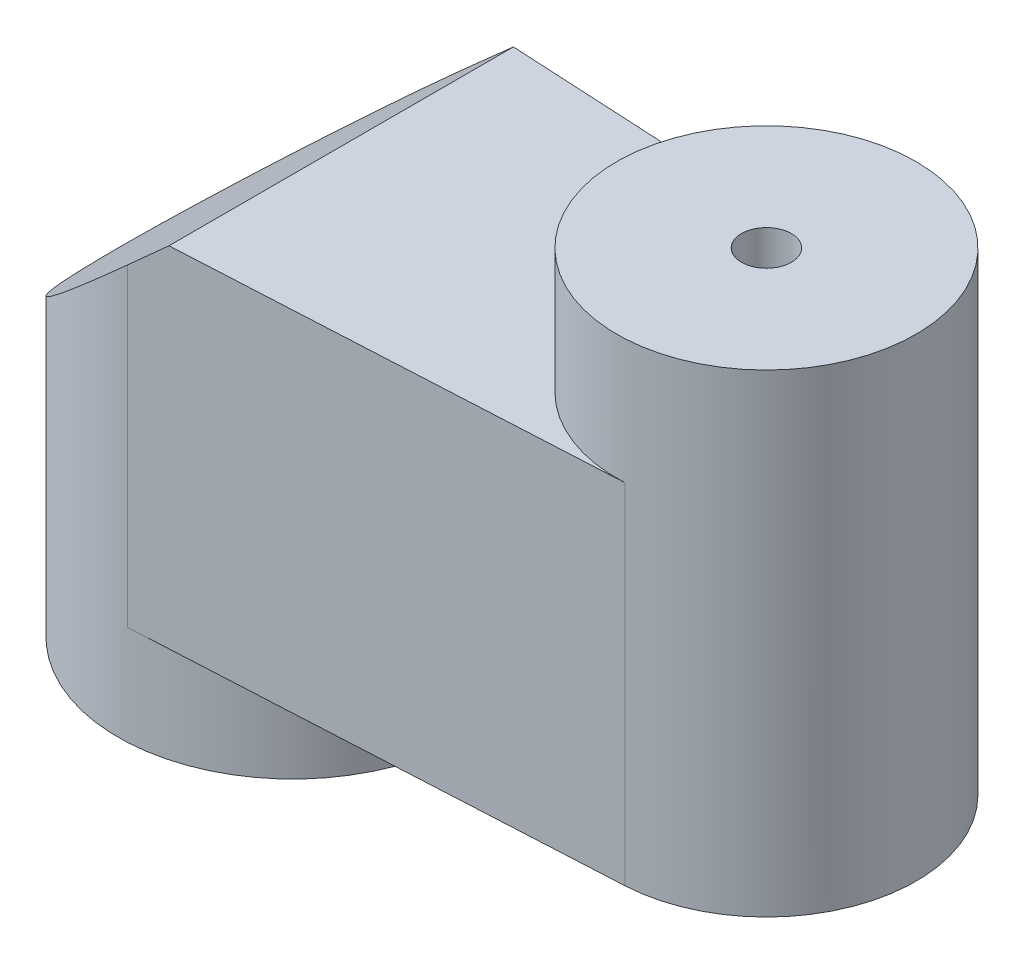
ISO-10303-21;
HEADER;
FILE_DESCRIPTION(('STEP AP214'),'2;1');
FILE_NAME('part.step','',(''),(''),'','','');
FILE_SCHEMA(('AUTOMOTIVE_DESIGN { 1 0 10303 214 1 1 1 1 }'));
ENDSEC;
DATA;
#1=APPLICATION_CONTEXT('core data for automotive mechanical design processes');
#2=APPLICATION_PROTOCOL_DEFINITION('international standard','automotive_design',2000,#1);
#3=PRODUCT_CONTEXT('',#1,'mechanical');
#4=PRODUCT('Part','Part','',(#3));
#5=PRODUCT_RELATED_PRODUCT_CATEGORY('part','',(#4));
#6=PRODUCT_DEFINITION_FORMATION('','',#4);
#7=PRODUCT_DEFINITION_CONTEXT('part definition',#1,'design');
#8=PRODUCT_DEFINITION('design','',#6,#7);
#9=PRODUCT_DEFINITION_SHAPE('','',#8);
#10=(LENGTH_UNIT() NAMED_UNIT(*) SI_UNIT(.MILLI.,.METRE.));
#11=(NAMED_UNIT(*) PLANE_ANGLE_UNIT() SI_UNIT($,.RADIAN.));
#12=(NAMED_UNIT(*) SI_UNIT($,.STERADIAN.) SOLID_ANGLE_UNIT());
#13=UNCERTAINTY_MEASURE_WITH_UNIT(LENGTH_MEASURE(1.E-05),#10,'distance_accuracy_value','');
#14=(GEOMETRIC_REPRESENTATION_CONTEXT(3) GLOBAL_UNCERTAINTY_ASSIGNED_CONTEXT((#13)) GLOBAL_UNIT_ASSIGNED_CONTEXT((#10,
#11,#12)) REPRESENTATION_CONTEXT('',''));
#15=CARTESIAN_POINT('',(0.,0.,0.));
#16=DIRECTION('',(0.,0.,1.));
#17=DIRECTION('',(1.,0.,0.));
#18=AXIS2_PLACEMENT_3D('',#15,#16,#17);
#19=CARTESIAN_POINT('',(0.,20.,0.));
#20=DIRECTION('',(0.,-1.,0.));
#21=DIRECTION('',(0.,0.,1.));
#22=AXIS2_PLACEMENT_3D('',#19,#20,#21);
#23=CYLINDRICAL_SURFACE('',#22,35.);
#24=CARTESIAN_POINT('',(0.,81.3049516849971,0.));
#25=DIRECTION('',(-0.666666666666667,0.74535599249993,0.));
#26=DIRECTION('',(-0.74535599249993,-0.666666666666667,0.));
#27=AXIS2_PLACEMENT_3D('',#24,#25,#26);
#28=ELLIPSE('',#27,46.9574275274956,35.);
#29=CARTESIAN_POINT('',(1.8421052631579,82.9525807210496,-34.9514899281768));
#30=VERTEX_POINT('',#29);
#31=CARTESIAN_POINT('',(1.8421052631579,82.9525807210496,34.9514899281768));
#32=VERTEX_POINT('',#31);
#33=EDGE_CURVE('E98',#30,#32,#28,.T.);
#34=ORIENTED_EDGE('',*,*,#33,.F.);
#35=DIRECTION('',(0.,-1.,0.));
#36=VECTOR('',#35,1.);
#37=CARTESIAN_POINT('',(1.8421052631579,90.,-34.9514899281768));
#38=LINE('',#37,#36);
#39=CARTESIAN_POINT('',(1.8421052631579,20.,-34.9514899281768));
#40=VERTEX_POINT('',#39);
#41=EDGE_CURVE('E122',#30,#40,#38,.T.);
#42=ORIENTED_EDGE('',*,*,#41,.T.);
#43=CARTESIAN_POINT('',(0.,20.,0.));
#44=DIRECTION('',(0.,-1.,0.));
#45=DIRECTION('',(0.,0.,-1.));
#46=AXIS2_PLACEMENT_3D('',#43,#44,#45);
#47=CIRCLE('',#46,35.);
#48=CARTESIAN_POINT('',(1.8421052631579,20.,34.9514899281768));
#49=VERTEX_POINT('',#48);
#50=EDGE_CURVE('E126',#40,#49,#47,.T.);
#51=ORIENTED_EDGE('',*,*,#50,.T.);
#52=DIRECTION('',(0.,-1.,0.));
#53=VECTOR('',#52,1.);
#54=CARTESIAN_POINT('',(1.8421052631579,90.,34.9514899281768));
#55=LINE('',#54,#53);
#56=EDGE_CURVE('E106',#32,#49,#55,.T.);
#57=ORIENTED_EDGE('',*,*,#56,.F.);
#58=EDGE_LOOP('',(#34,#42,#51,#57));
#59=FACE_BOUND('',#58,.T.);
#60=CARTESIAN_POINT('',(0.,0.,0.));
#61=DIRECTION('',(0.,-1.,0.));
#62=DIRECTION('',(0.,0.,-1.));
#63=AXIS2_PLACEMENT_3D('',#60,#61,#62);
#64=CIRCLE('',#63,35.);
#65=CARTESIAN_POINT('',(0.,0.,-35.));
#66=VERTEX_POINT('',#65);
#67=EDGE_CURVE('E125',#66,#66,#64,.T.);
#68=ORIENTED_EDGE('',*,*,#67,.F.);
#69=EDGE_LOOP('',(#68));
#70=FACE_BOUND('',#69,.T.);
#71=ADVANCED_FACE('F43',(#59,#70),#23,.T.);
#72=CARTESIAN_POINT('',(0.,0.,0.));
#73=DIRECTION('',(0.,1.,0.));
#74=DIRECTION('',(0.,0.,-1.));
#75=AXIS2_PLACEMENT_3D('',#72,#73,#74);
#76=PLANE('',#75);
#77=ORIENTED_EDGE('',*,*,#67,.T.);
#78=EDGE_LOOP('',(#77));
#79=FACE_BOUND('',#78,.T.);
#80=ADVANCED_FACE('F131',(#79),#76,.F.);
#81=CARTESIAN_POINT('',(0.,20.,0.));
#82=DIRECTION('',(0.,1.,0.));
#83=DIRECTION('',(0.,0.,-1.));
#84=AXIS2_PLACEMENT_3D('',#81,#82,#83);
#85=PLANE('',#84);
#86=CARTESIAN_POINT('',(95.,20.,0.));
#87=DIRECTION('',(0.,-1.,0.));
#88=DIRECTION('',(0.,0.,-1.));
#89=AXIS2_PLACEMENT_3D('',#86,#87,#88);
#90=CIRCLE('',#89,5.);
#91=CARTESIAN_POINT('',(95.,20.,-5.));
#92=VERTEX_POINT('',#91);
#93=EDGE_CURVE('E101',#92,#92,#90,.T.);
#94=ORIENTED_EDGE('',*,*,#93,.F.);
#95=EDGE_LOOP('',(#94));
#96=FACE_BOUND('',#95,.T.);
#97=DIRECTION('',(0.998613997947909,0.,0.0526315789473686));
#98=VECTOR('',#97,1.);
#99=CARTESIAN_POINT('',(1.8421052631579,20.,-34.9514899281768));
#100=LINE('',#99,#98);
#101=CARTESIAN_POINT('',(96.5789473684211,20.,-29.9584199384373));
#102=VERTEX_POINT('',#101);
#103=EDGE_CURVE('E112',#40,#102,#100,.T.);
#104=ORIENTED_EDGE('',*,*,#103,.T.);
#105=CARTESIAN_POINT('',(95.,20.,0.));
#106=DIRECTION('',(0.,-1.,0.));
#107=DIRECTION('',(0.,0.,-1.));
#108=AXIS2_PLACEMENT_3D('',#105,#106,#107);
#109=CIRCLE('',#108,30.);
#110=CARTESIAN_POINT('',(96.5789473684211,20.,29.9584199384373));
#111=VERTEX_POINT('',#110);
#112=EDGE_CURVE('E115',#102,#111,#109,.T.);
#113=ORIENTED_EDGE('',*,*,#112,.T.);
#114=DIRECTION('',(-0.998613997947909,0.,0.0526315789473685));
#115=VECTOR('',#114,1.);
#116=CARTESIAN_POINT('',(1.8421052631579,20.,34.9514899281768));
#117=LINE('',#116,#115);
#118=EDGE_CURVE('E63',#111,#49,#117,.T.);
#119=ORIENTED_EDGE('',*,*,#118,.T.);
#120=ORIENTED_EDGE('',*,*,#50,.F.);
#121=EDGE_LOOP('',(#104,#113,#119,#120));
#122=FACE_BOUND('',#121,.T.);
#123=ADVANCED_FACE('F138',(#96,#122),#85,.F.);
#124=CARTESIAN_POINT('',(1.8421052631579,90.,-34.9514899281768));
#125=DIRECTION('',(-0.0526315789473686,0.,0.998613997947909));
#126=DIRECTION('',(-0.998613997947909,0.,-0.0526315789473686));
#127=AXIS2_PLACEMENT_3D('',#124,#125,#126);
#128=PLANE('',#127);
#129=DIRECTION('',(0.998613997947909,0.,0.0526315789473686));
#130=VECTOR('',#129,1.);
#131=CARTESIAN_POINT('',(1.8421052631579,90.,-34.9514899281768));
#132=LINE('',#131,#130);
#133=CARTESIAN_POINT('',(9.72135954999578,90.,-34.536216764676));
#134=VERTEX_POINT('',#133);
#135=CARTESIAN_POINT('',(96.5789473684211,90.,-29.9584199384373));
#136=VERTEX_POINT('',#135);
#137=EDGE_CURVE('E93',#134,#136,#132,.T.);
#138=ORIENTED_EDGE('',*,*,#137,.T.);
#139=DIRECTION('',(0.,-1.,0.));
#140=VECTOR('',#139,1.);
#141=CARTESIAN_POINT('',(96.5789473684211,90.,-29.9584199384373));
#142=LINE('',#141,#140);
#143=EDGE_CURVE('E120',#136,#102,#142,.T.);
#144=ORIENTED_EDGE('',*,*,#143,.T.);
#145=ORIENTED_EDGE('',*,*,#103,.F.);
#146=ORIENTED_EDGE('',*,*,#41,.F.);
#147=DIRECTION('',(-0.744781536929041,-0.666152857984043,-0.0392534335989431));
#148=VECTOR('',#147,1.);
#149=CARTESIAN_POINT('',(5.33860023173927,86.0799408941431,-34.7672084627096));
#150=LINE('',#149,#148);
#151=EDGE_CURVE('E140',#134,#30,#150,.T.);
#152=ORIENTED_EDGE('',*,*,#151,.F.);
#153=EDGE_LOOP('',(#138,#144,#145,#146,#152));
#154=FACE_BOUND('',#153,.T.);
#155=ADVANCED_FACE('F152',(#154),#128,.F.);
#156=CARTESIAN_POINT('',(95.,90.,0.));
#157=DIRECTION('',(0.,-1.,0.));
#158=DIRECTION('',(0.,0.,1.));
#159=AXIS2_PLACEMENT_3D('',#156,#157,#158);
#160=CYLINDRICAL_SURFACE('',#159,30.);
#161=ORIENTED_EDGE('',*,*,#112,.F.);
#162=ORIENTED_EDGE('',*,*,#143,.F.);
#163=CARTESIAN_POINT('',(95.,90.,0.));
#164=DIRECTION('',(0.,-1.,0.));
#165=DIRECTION('',(0.,0.,-1.));
#166=AXIS2_PLACEMENT_3D('',#163,#164,#165);
#167=CIRCLE('',#166,30.);
#168=CARTESIAN_POINT('',(96.5789473684211,90.,29.9584199384373));
#169=VERTEX_POINT('',#168);
#170=EDGE_CURVE('E50',#169,#136,#167,.T.);
#171=ORIENTED_EDGE('',*,*,#170,.F.);
#172=DIRECTION('',(0.,-1.,0.));
#173=VECTOR('',#172,1.);
#174=CARTESIAN_POINT('',(96.5789473684211,90.,29.9584199384373));
#175=LINE('',#174,#173);
#176=EDGE_CURVE('E104',#169,#111,#175,.T.);
#177=ORIENTED_EDGE('',*,*,#176,.T.);
#178=EDGE_LOOP('',(#161,#162,#171,#177));
#179=FACE_BOUND('',#178,.T.);
#180=CARTESIAN_POINT('',(95.,115.,0.));
#181=DIRECTION('',(0.,-1.,0.));
#182=DIRECTION('',(0.,0.,-1.));
#183=AXIS2_PLACEMENT_3D('',#180,#181,#182);
#184=CIRCLE('',#183,30.);
#185=CARTESIAN_POINT('',(95.,115.,-30.));
#186=VERTEX_POINT('',#185);
#187=EDGE_CURVE('E116',#186,#186,#184,.T.);
#188=ORIENTED_EDGE('',*,*,#187,.T.);
#189=EDGE_LOOP('',(#188));
#190=FACE_BOUND('',#189,.T.);
#191=ADVANCED_FACE('F149',(#179,#190),#160,.T.);
#192=CARTESIAN_POINT('',(1.8421052631579,90.,34.9514899281768));
#193=DIRECTION('',(-0.0526315789473685,0.,-0.998613997947909));
#194=DIRECTION('',(0.998613997947909,0.,-0.0526315789473685));
#195=AXIS2_PLACEMENT_3D('',#192,#193,#194);
#196=PLANE('',#195);
#197=ORIENTED_EDGE('',*,*,#56,.T.);
#198=ORIENTED_EDGE('',*,*,#118,.F.);
#199=ORIENTED_EDGE('',*,*,#176,.F.);
#200=DIRECTION('',(-0.998613997947909,0.,0.0526315789473685));
#201=VECTOR('',#200,1.);
#202=CARTESIAN_POINT('',(1.8421052631579,90.,34.9514899281768));
#203=LINE('',#202,#201);
#204=CARTESIAN_POINT('',(9.72135954999578,90.,34.5362167646759));
#205=VERTEX_POINT('',#204);
#206=EDGE_CURVE('E90',#169,#205,#203,.T.);
#207=ORIENTED_EDGE('',*,*,#206,.T.);
#208=DIRECTION('',(0.744781536929041,0.666152857984043,-0.039253433598943));
#209=VECTOR('',#208,1.);
#210=CARTESIAN_POINT('',(5.33860023173927,86.0799408941431,34.7672084627096));
#211=LINE('',#210,#209);
#212=EDGE_CURVE('E95',#32,#205,#211,.T.);
#213=ORIENTED_EDGE('',*,*,#212,.F.);
#214=EDGE_LOOP('',(#197,#198,#199,#207,#213));
#215=FACE_BOUND('',#214,.T.);
#216=ADVANCED_FACE('F103',(#215),#196,.F.);
#217=CARTESIAN_POINT('',(0.,90.,0.));
#218=DIRECTION('',(0.,1.,0.));
#219=DIRECTION('',(0.,0.,-1.));
#220=AXIS2_PLACEMENT_3D('',#217,#218,#219);
#221=PLANE('',#220);
#222=DIRECTION('',(0.,0.,1.));
#223=VECTOR('',#222,1.);
#224=CARTESIAN_POINT('',(9.72135954999578,90.,0.));
#225=LINE('',#224,#223);
#226=EDGE_CURVE('E11',#134,#205,#225,.T.);
#227=ORIENTED_EDGE('',*,*,#226,.T.);
#228=ORIENTED_EDGE('',*,*,#206,.F.);
#229=ORIENTED_EDGE('',*,*,#170,.T.);
#230=ORIENTED_EDGE('',*,*,#137,.F.);
#231=EDGE_LOOP('',(#227,#228,#229,#230));
#232=FACE_BOUND('',#231,.T.);
#233=ADVANCED_FACE('F88',(#232),#221,.T.);
#234=CARTESIAN_POINT('',(95.,115.,0.));
#235=DIRECTION('',(0.,1.,0.));
#236=DIRECTION('',(0.,0.,-1.));
#237=AXIS2_PLACEMENT_3D('',#234,#235,#236);
#238=PLANE('',#237);
#239=CARTESIAN_POINT('',(95.,115.,0.));
#240=DIRECTION('',(0.,-1.,0.));
#241=DIRECTION('',(0.,0.,-1.));
#242=AXIS2_PLACEMENT_3D('',#239,#240,#241);
#243=CIRCLE('',#242,5.);
#244=CARTESIAN_POINT('',(95.,115.,-5.));
#245=VERTEX_POINT('',#244);
#246=EDGE_CURVE('E242',#245,#245,#243,.T.);
#247=ORIENTED_EDGE('',*,*,#246,.T.);
#248=EDGE_LOOP('',(#247));
#249=FACE_BOUND('',#248,.T.);
#250=ORIENTED_EDGE('',*,*,#187,.F.);
#251=EDGE_LOOP('',(#250));
#252=FACE_BOUND('',#251,.T.);
#253=ADVANCED_FACE('F183',(#249,#252),#238,.T.);
#254=CARTESIAN_POINT('',(9.72135954999578,90.,44.));
#255=DIRECTION('',(0.666666666666667,-0.74535599249993,0.));
#256=DIRECTION('',(0.74535599249993,0.666666666666667,0.));
#257=AXIS2_PLACEMENT_3D('',#254,#255,#256);
#258=PLANE('',#257);
#259=ORIENTED_EDGE('',*,*,#226,.F.);
#260=ORIENTED_EDGE('',*,*,#151,.T.);
#261=ORIENTED_EDGE('',*,*,#33,.T.);
#262=ORIENTED_EDGE('',*,*,#212,.T.);
#263=EDGE_LOOP('',(#259,#260,#261,#262));
#264=FACE_BOUND('',#263,.T.);
#265=ADVANCED_FACE('F96',(#264),#258,.F.);
#266=CARTESIAN_POINT('',(95.,0.,0.));
#267=DIRECTION('',(0.,1.,0.));
#268=DIRECTION('',(0.,0.,-1.));
#269=AXIS2_PLACEMENT_3D('',#266,#267,#268);
#270=CYLINDRICAL_SURFACE('',#269,5.);
#271=CARTESIAN_POINT('',(95.,115.,-5.));
#272=CARTESIAN_POINT('',(95.,114.010416666667,-5.));
#273=CARTESIAN_POINT('',(95.,113.020833333333,-5.));
#274=CARTESIAN_POINT('',(95.,111.041666666667,-5.));
#275=CARTESIAN_POINT('',(95.,110.052083333333,-5.));
#276=CARTESIAN_POINT('',(95.,108.072916666667,-5.));
#277=CARTESIAN_POINT('',(95.,107.083333333333,-5.));
#278=CARTESIAN_POINT('',(95.,105.104166666667,-5.));
#279=CARTESIAN_POINT('',(95.,104.114583333333,-5.));
#280=CARTESIAN_POINT('',(95.,102.135416666667,-5.));
#281=CARTESIAN_POINT('',(95.,101.145833333333,-5.));
#282=CARTESIAN_POINT('',(95.,99.1666666666667,-5.));
#283=CARTESIAN_POINT('',(95.,98.1770833333334,-5.));
#284=CARTESIAN_POINT('',(95.,96.1979166666667,-5.));
#285=CARTESIAN_POINT('',(95.,95.2083333333334,-5.));
#286=CARTESIAN_POINT('',(95.,93.2291666666667,-5.));
#287=CARTESIAN_POINT('',(95.,92.2395833333334,-5.));
#288=CARTESIAN_POINT('',(95.,90.2604166666667,-5.));
#289=CARTESIAN_POINT('',(95.,89.2708333333334,-5.));
#290=CARTESIAN_POINT('',(95.,87.2916666666667,-5.));
#291=CARTESIAN_POINT('',(95.,86.3020833333334,-5.));
#292=CARTESIAN_POINT('',(95.,84.3229166666667,-5.));
#293=CARTESIAN_POINT('',(95.,83.3333333333334,-5.));
#294=CARTESIAN_POINT('',(95.,81.3541666666667,-5.));
#295=CARTESIAN_POINT('',(95.,80.3645833333334,-5.));
#296=CARTESIAN_POINT('',(95.,78.3854166666667,-5.));
#297=CARTESIAN_POINT('',(95.,77.3958333333334,-5.));
#298=CARTESIAN_POINT('',(95.,75.4166666666667,-5.));
#299=CARTESIAN_POINT('',(95.,74.4270833333334,-5.));
#300=CARTESIAN_POINT('',(95.,72.4479166666667,-5.));
#301=CARTESIAN_POINT('',(95.,71.4583333333333,-5.));
#302=CARTESIAN_POINT('',(95.,69.4791666666667,-5.));
#303=CARTESIAN_POINT('',(95.,68.4895833333334,-5.));
#304=CARTESIAN_POINT('',(95.,66.5104166666667,-5.));
#305=CARTESIAN_POINT('',(95.,65.5208333333333,-5.));
#306=CARTESIAN_POINT('',(95.,63.5416666666667,-5.));
#307=CARTESIAN_POINT('',(95.,62.5520833333333,-5.));
#308=CARTESIAN_POINT('',(95.,60.5729166666667,-5.));
#309=CARTESIAN_POINT('',(95.,59.5833333333333,-5.));
#310=CARTESIAN_POINT('',(95.,57.6041666666667,-5.));
#311=CARTESIAN_POINT('',(95.,56.6145833333333,-5.));
#312=CARTESIAN_POINT('',(95.,54.6354166666667,-5.));
#313=CARTESIAN_POINT('',(95.,53.6458333333333,-5.));
#314=CARTESIAN_POINT('',(95.,51.6666666666667,-5.));
#315=CARTESIAN_POINT('',(95.,50.6770833333333,-5.));
#316=CARTESIAN_POINT('',(95.,48.6979166666667,-5.));
#317=CARTESIAN_POINT('',(95.,47.7083333333333,-5.));
#318=CARTESIAN_POINT('',(95.,45.7291666666667,-5.));
#319=CARTESIAN_POINT('',(95.,44.7395833333333,-5.));
#320=CARTESIAN_POINT('',(95.,42.7604166666667,-5.));
#321=CARTESIAN_POINT('',(95.,41.7708333333333,-5.));
#322=CARTESIAN_POINT('',(95.,39.7916666666667,-5.));
#323=CARTESIAN_POINT('',(95.,38.8020833333333,-5.));
#324=CARTESIAN_POINT('',(95.,36.8229166666667,-5.));
#325=CARTESIAN_POINT('',(95.,35.8333333333333,-5.));
#326=CARTESIAN_POINT('',(95.,33.8541666666667,-5.));
#327=CARTESIAN_POINT('',(95.,32.8645833333333,-5.));
#328=CARTESIAN_POINT('',(95.,30.8854166666667,-5.));
#329=CARTESIAN_POINT('',(95.,29.8958333333333,-5.));
#330=CARTESIAN_POINT('',(95.,27.9166666666667,-5.));
#331=CARTESIAN_POINT('',(95.,26.9270833333333,-5.));
#332=CARTESIAN_POINT('',(95.,24.9479166666667,-5.));
#333=CARTESIAN_POINT('',(95.,23.9583333333333,-5.));
#334=CARTESIAN_POINT('',(95.,21.9791666666667,-5.));
#335=CARTESIAN_POINT('',(95.,20.9895833333333,-5.));
#336=CARTESIAN_POINT('',(95.,20.,-5.));
#337=B_SPLINE_CURVE_WITH_KNOTS('',3,(#271,#272,#273,#274,#275,#276,#277,#278,#279,#280,#281,
#282,#283,#284,#285,#286,#287,#288,#289,#290,#291,#292,#293,#294,#295,#296,#297,#298,#299,#300,
#301,#302,#303,#304,#305,#306,#307,#308,#309,#310,#311,#312,#313,#314,#315,#316,#317,#318,#319,
#320,#321,#322,#323,#324,#325,#326,#327,#328,#329,#330,#331,#332,#333,#334,#335,#336),
.UNSPECIFIED.,.F.,.F.,(4,2,2,2,2,2,2,2,2,2,2,2,2,2,2,2,2,2,2,2,2,2,2,2,2,2,2,2,2,2,2,2,4),(0.,
2.96875000000001,5.9375,8.90625,11.875,14.84375,17.8125,20.78125,23.75,26.71875,29.6875,
32.65625,35.625,38.59375,41.5625,44.53125,47.5,50.46875,53.4375,56.40625,59.375,62.34375,
65.3125,68.28125,71.25,74.21875,77.1875,80.15625,83.125,86.09375,89.0625,92.03125,95.),.UNSPECIFIED.);
#338=EDGE_CURVE('BSEAM197',#245,#92,#337,.T.);
#339=ORIENTED_EDGE('',*,*,#246,.F.);
#340=ORIENTED_EDGE('',*,*,#93,.T.);
#341=ORIENTED_EDGE('',*,*,#338,.T.);
#342=ORIENTED_EDGE('',*,*,#338,.F.);
#343=EDGE_LOOP('',(#339,#341,#340,#342));
#344=FACE_BOUND('',#343,.T.);
#345=ADVANCED_FACE('F197',(#344),#270,.F.);
#346=CLOSED_SHELL('',(#71,#80,#123,#155,#191,#216,#233,#253,#265,#345));
#347=MANIFOLD_SOLID_BREP('B2',#346);
#348=ADVANCED_BREP_SHAPE_REPRESENTATION('',(#18,#347),#14);
#349=SHAPE_DEFINITION_REPRESENTATION(#9,#348);
ENDSEC;
END-ISO-10303-21;
